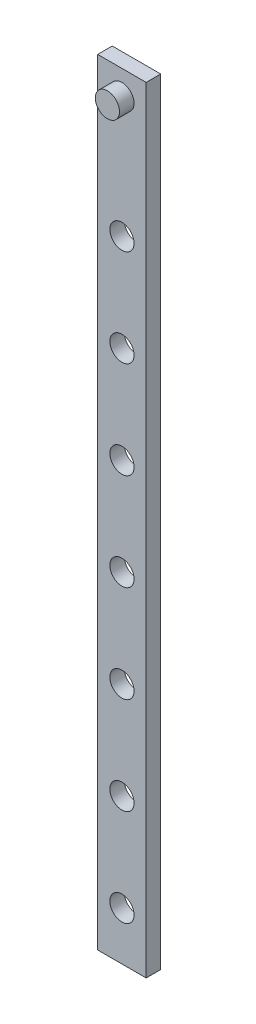
ISO-10303-21;
HEADER;
FILE_DESCRIPTION(('STEP AP214'),'2;1');
FILE_NAME('part.step','',(''),(''),'','','');
FILE_SCHEMA(('AUTOMOTIVE_DESIGN { 1 0 10303 214 1 1 1 1 }'));
ENDSEC;
DATA;
#1=APPLICATION_CONTEXT('core data for automotive mechanical design processes');
#2=APPLICATION_PROTOCOL_DEFINITION('international standard','automotive_design',2000,#1);
#3=PRODUCT_CONTEXT('',#1,'mechanical');
#4=PRODUCT('Part','Part','',(#3));
#5=PRODUCT_RELATED_PRODUCT_CATEGORY('part','',(#4));
#6=PRODUCT_DEFINITION_FORMATION('','',#4);
#7=PRODUCT_DEFINITION_CONTEXT('part definition',#1,'design');
#8=PRODUCT_DEFINITION('design','',#6,#7);
#9=PRODUCT_DEFINITION_SHAPE('','',#8);
#10=(LENGTH_UNIT() NAMED_UNIT(*) SI_UNIT(.MILLI.,.METRE.));
#11=(NAMED_UNIT(*) PLANE_ANGLE_UNIT() SI_UNIT($,.RADIAN.));
#12=(NAMED_UNIT(*) SI_UNIT($,.STERADIAN.) SOLID_ANGLE_UNIT());
#13=UNCERTAINTY_MEASURE_WITH_UNIT(LENGTH_MEASURE(1.E-05),#10,'distance_accuracy_value','');
#14=(GEOMETRIC_REPRESENTATION_CONTEXT(3) GLOBAL_UNCERTAINTY_ASSIGNED_CONTEXT((#13)) GLOBAL_UNIT_ASSIGNED_CONTEXT((#10,
#11,#12)) REPRESENTATION_CONTEXT('',''));
#15=CARTESIAN_POINT('',(0.,0.,0.));
#16=DIRECTION('',(0.,0.,1.));
#17=DIRECTION('',(1.,0.,0.));
#18=AXIS2_PLACEMENT_3D('',#15,#16,#17);
#19=CARTESIAN_POINT('',(0.,0.,3.));
#20=DIRECTION('',(0.,0.,-1.));
#21=DIRECTION('',(-1.,0.,0.));
#22=AXIS2_PLACEMENT_3D('',#19,#20,#21);
#23=PLANE('',#22);
#24=CARTESIAN_POINT('',(0.,75.,3.));
#25=DIRECTION('',(0.,0.,-1.));
#26=DIRECTION('',(-1.,0.,0.));
#27=AXIS2_PLACEMENT_3D('',#24,#25,#26);
#28=CIRCLE('',#27,2.5);
#29=CARTESIAN_POINT('',(-2.5,75.,3.));
#30=VERTEX_POINT('',#29);
#31=EDGE_CURVE('E11',#30,#30,#28,.F.);
#32=ORIENTED_EDGE('',*,*,#31,.F.);
#33=EDGE_LOOP('',(#32));
#34=FACE_BOUND('',#33,.T.);
#35=DIRECTION('',(0.,1.,0.));
#36=VECTOR('',#35,1.);
#37=CARTESIAN_POINT('',(4.99999999999997,-80.,3.));
#38=LINE('',#37,#36);
#39=CARTESIAN_POINT('',(4.99999999999997,-80.,3.));
#40=VERTEX_POINT('',#39);
#41=CARTESIAN_POINT('',(5.00000000000003,80.,3.));
#42=VERTEX_POINT('',#41);
#43=EDGE_CURVE('E86',#40,#42,#38,.T.);
#44=ORIENTED_EDGE('',*,*,#43,.T.);
#45=DIRECTION('',(-1.,0.,0.));
#46=VECTOR('',#45,1.);
#47=CARTESIAN_POINT('',(-4.99999999999997,80.,3.));
#48=LINE('',#47,#46);
#49=CARTESIAN_POINT('',(-4.99999999999997,80.,3.));
#50=VERTEX_POINT('',#49);
#51=EDGE_CURVE('E81',#42,#50,#48,.T.);
#52=ORIENTED_EDGE('',*,*,#51,.T.);
#53=DIRECTION('',(0.,-1.,0.));
#54=VECTOR('',#53,1.);
#55=CARTESIAN_POINT('',(-4.99999999999997,-80.,3.));
#56=LINE('',#55,#54);
#57=CARTESIAN_POINT('',(-4.99999999999997,-80.,3.));
#58=VERTEX_POINT('',#57);
#59=EDGE_CURVE('E84',#50,#58,#56,.T.);
#60=ORIENTED_EDGE('',*,*,#59,.T.);
#61=DIRECTION('',(1.,0.,0.));
#62=VECTOR('',#61,1.);
#63=CARTESIAN_POINT('',(-4.99999999999997,-80.,3.));
#64=LINE('',#63,#62);
#65=EDGE_CURVE('E50',#58,#40,#64,.T.);
#66=ORIENTED_EDGE('',*,*,#65,.T.);
#67=EDGE_LOOP('',(#44,#52,#60,#66));
#68=FACE_BOUND('',#67,.T.);
#69=CARTESIAN_POINT('',(0.,-70.,3.));
#70=DIRECTION('',(0.,0.,1.));
#71=DIRECTION('',(1.,0.,0.));
#72=AXIS2_PLACEMENT_3D('',#69,#70,#71);
#73=CIRCLE('',#72,2.5);
#74=CARTESIAN_POINT('',(2.5,-70.,3.));
#75=VERTEX_POINT('',#74);
#76=EDGE_CURVE('E103',#75,#75,#73,.T.);
#77=ORIENTED_EDGE('',*,*,#76,.F.);
#78=EDGE_LOOP('',(#77));
#79=FACE_BOUND('',#78,.T.);
#80=CARTESIAN_POINT('',(0.,-50.,3.));
#81=DIRECTION('',(0.,0.,1.));
#82=DIRECTION('',(1.,0.,0.));
#83=AXIS2_PLACEMENT_3D('',#80,#81,#82);
#84=CIRCLE('',#83,2.5);
#85=CARTESIAN_POINT('',(2.5,-50.,3.));
#86=VERTEX_POINT('',#85);
#87=EDGE_CURVE('E161',#86,#86,#84,.T.);
#88=ORIENTED_EDGE('',*,*,#87,.F.);
#89=EDGE_LOOP('',(#88));
#90=FACE_BOUND('',#89,.T.);
#91=CARTESIAN_POINT('',(0.,-30.,3.));
#92=DIRECTION('',(0.,0.,1.));
#93=DIRECTION('',(1.,0.,0.));
#94=AXIS2_PLACEMENT_3D('',#91,#92,#93);
#95=CIRCLE('',#94,2.5);
#96=CARTESIAN_POINT('',(2.5,-30.,3.));
#97=VERTEX_POINT('',#96);
#98=EDGE_CURVE('E156',#97,#97,#95,.T.);
#99=ORIENTED_EDGE('',*,*,#98,.F.);
#100=EDGE_LOOP('',(#99));
#101=FACE_BOUND('',#100,.T.);
#102=CARTESIAN_POINT('',(0.,-10.,3.));
#103=DIRECTION('',(0.,0.,1.));
#104=DIRECTION('',(1.,0.,0.));
#105=AXIS2_PLACEMENT_3D('',#102,#103,#104);
#106=CIRCLE('',#105,2.5);
#107=CARTESIAN_POINT('',(2.5,-10.,3.));
#108=VERTEX_POINT('',#107);
#109=EDGE_CURVE('E151',#108,#108,#106,.T.);
#110=ORIENTED_EDGE('',*,*,#109,.F.);
#111=EDGE_LOOP('',(#110));
#112=FACE_BOUND('',#111,.T.);
#113=CARTESIAN_POINT('',(0.,9.99999999999997,3.));
#114=DIRECTION('',(0.,0.,1.));
#115=DIRECTION('',(1.,0.,0.));
#116=AXIS2_PLACEMENT_3D('',#113,#114,#115);
#117=CIRCLE('',#116,2.5);
#118=CARTESIAN_POINT('',(2.5,9.99999999999997,3.));
#119=VERTEX_POINT('',#118);
#120=EDGE_CURVE('E146',#119,#119,#117,.T.);
#121=ORIENTED_EDGE('',*,*,#120,.F.);
#122=EDGE_LOOP('',(#121));
#123=FACE_BOUND('',#122,.T.);
#124=CARTESIAN_POINT('',(0.,30.,3.));
#125=DIRECTION('',(0.,0.,1.));
#126=DIRECTION('',(1.,0.,0.));
#127=AXIS2_PLACEMENT_3D('',#124,#125,#126);
#128=CIRCLE('',#127,2.5);
#129=CARTESIAN_POINT('',(2.5,30.,3.));
#130=VERTEX_POINT('',#129);
#131=EDGE_CURVE('E141',#130,#130,#128,.T.);
#132=ORIENTED_EDGE('',*,*,#131,.F.);
#133=EDGE_LOOP('',(#132));
#134=FACE_BOUND('',#133,.T.);
#135=CARTESIAN_POINT('',(0.,50.,3.));
#136=DIRECTION('',(0.,0.,1.));
#137=DIRECTION('',(1.,0.,0.));
#138=AXIS2_PLACEMENT_3D('',#135,#136,#137);
#139=CIRCLE('',#138,2.5);
#140=CARTESIAN_POINT('',(2.5,50.,3.));
#141=VERTEX_POINT('',#140);
#142=EDGE_CURVE('E132',#141,#141,#139,.T.);
#143=ORIENTED_EDGE('',*,*,#142,.F.);
#144=EDGE_LOOP('',(#143));
#145=FACE_BOUND('',#144,.T.);
#146=ADVANCED_FACE('F33',(#34,#68,#79,#90,#101,#112,#123,#134,#145),#23,.F.);
#147=CARTESIAN_POINT('',(0.,0.,0.));
#148=DIRECTION('',(0.,0.,-1.));
#149=DIRECTION('',(-1.,0.,0.));
#150=AXIS2_PLACEMENT_3D('',#147,#148,#149);
#151=PLANE('',#150);
#152=CARTESIAN_POINT('',(0.,30.,0.));
#153=DIRECTION('',(0.,0.,1.));
#154=DIRECTION('',(1.,0.,0.));
#155=AXIS2_PLACEMENT_3D('',#152,#153,#154);
#156=CIRCLE('',#155,2.5);
#157=CARTESIAN_POINT('',(2.5,30.,0.));
#158=VERTEX_POINT('',#157);
#159=EDGE_CURVE('E136',#158,#158,#156,.T.);
#160=ORIENTED_EDGE('',*,*,#159,.T.);
#161=EDGE_LOOP('',(#160));
#162=FACE_BOUND('',#161,.T.);
#163=CARTESIAN_POINT('',(0.,-10.,0.));
#164=DIRECTION('',(0.,0.,1.));
#165=DIRECTION('',(1.,0.,0.));
#166=AXIS2_PLACEMENT_3D('',#163,#164,#165);
#167=CIRCLE('',#166,2.5);
#168=CARTESIAN_POINT('',(2.5,-10.,0.));
#169=VERTEX_POINT('',#168);
#170=EDGE_CURVE('E149',#169,#169,#167,.T.);
#171=ORIENTED_EDGE('',*,*,#170,.T.);
#172=EDGE_LOOP('',(#171));
#173=FACE_BOUND('',#172,.T.);
#174=CARTESIAN_POINT('',(0.,-50.,0.));
#175=DIRECTION('',(0.,0.,1.));
#176=DIRECTION('',(1.,0.,0.));
#177=AXIS2_PLACEMENT_3D('',#174,#175,#176);
#178=CIRCLE('',#177,2.5);
#179=CARTESIAN_POINT('',(2.5,-50.,0.));
#180=VERTEX_POINT('',#179);
#181=EDGE_CURVE('E159',#180,#180,#178,.T.);
#182=ORIENTED_EDGE('',*,*,#181,.T.);
#183=EDGE_LOOP('',(#182));
#184=FACE_BOUND('',#183,.T.);
#185=DIRECTION('',(0.,1.,0.));
#186=VECTOR('',#185,1.);
#187=CARTESIAN_POINT('',(4.99999999999997,-80.,0.));
#188=LINE('',#187,#186);
#189=CARTESIAN_POINT('',(4.99999999999997,-80.,0.));
#190=VERTEX_POINT('',#189);
#191=CARTESIAN_POINT('',(5.00000000000003,80.,0.));
#192=VERTEX_POINT('',#191);
#193=EDGE_CURVE('E100',#190,#192,#188,.T.);
#194=ORIENTED_EDGE('',*,*,#193,.F.);
#195=DIRECTION('',(1.,0.,0.));
#196=VECTOR('',#195,1.);
#197=CARTESIAN_POINT('',(-4.99999999999997,-80.,0.));
#198=LINE('',#197,#196);
#199=CARTESIAN_POINT('',(-4.99999999999997,-80.,0.));
#200=VERTEX_POINT('',#199);
#201=EDGE_CURVE('E73',#200,#190,#198,.T.);
#202=ORIENTED_EDGE('',*,*,#201,.F.);
#203=DIRECTION('',(0.,-1.,0.));
#204=VECTOR('',#203,1.);
#205=CARTESIAN_POINT('',(-4.99999999999997,-80.,0.));
#206=LINE('',#205,#204);
#207=CARTESIAN_POINT('',(-4.99999999999997,80.,0.));
#208=VERTEX_POINT('',#207);
#209=EDGE_CURVE('E67',#208,#200,#206,.T.);
#210=ORIENTED_EDGE('',*,*,#209,.F.);
#211=DIRECTION('',(-1.,0.,0.));
#212=VECTOR('',#211,1.);
#213=CARTESIAN_POINT('',(-4.99999999999997,80.,0.));
#214=LINE('',#213,#212);
#215=EDGE_CURVE('E91',#192,#208,#214,.T.);
#216=ORIENTED_EDGE('',*,*,#215,.F.);
#217=EDGE_LOOP('',(#194,#202,#210,#216));
#218=FACE_BOUND('',#217,.T.);
#219=CARTESIAN_POINT('',(0.,-70.,0.));
#220=DIRECTION('',(0.,0.,1.));
#221=DIRECTION('',(1.,0.,0.));
#222=AXIS2_PLACEMENT_3D('',#219,#220,#221);
#223=CIRCLE('',#222,2.5);
#224=CARTESIAN_POINT('',(2.5,-70.,0.));
#225=VERTEX_POINT('',#224);
#226=EDGE_CURVE('E119',#225,#225,#223,.T.);
#227=ORIENTED_EDGE('',*,*,#226,.T.);
#228=EDGE_LOOP('',(#227));
#229=FACE_BOUND('',#228,.T.);
#230=CARTESIAN_POINT('',(0.,-30.,0.));
#231=DIRECTION('',(0.,0.,1.));
#232=DIRECTION('',(1.,0.,0.));
#233=AXIS2_PLACEMENT_3D('',#230,#231,#232);
#234=CIRCLE('',#233,2.5);
#235=CARTESIAN_POINT('',(2.5,-30.,0.));
#236=VERTEX_POINT('',#235);
#237=EDGE_CURVE('E123',#236,#236,#234,.T.);
#238=ORIENTED_EDGE('',*,*,#237,.T.);
#239=EDGE_LOOP('',(#238));
#240=FACE_BOUND('',#239,.T.);
#241=CARTESIAN_POINT('',(0.,9.99999999999997,0.));
#242=DIRECTION('',(0.,0.,1.));
#243=DIRECTION('',(1.,0.,0.));
#244=AXIS2_PLACEMENT_3D('',#241,#242,#243);
#245=CIRCLE('',#244,2.5);
#246=CARTESIAN_POINT('',(2.5,9.99999999999997,0.));
#247=VERTEX_POINT('',#246);
#248=EDGE_CURVE('E127',#247,#247,#245,.T.);
#249=ORIENTED_EDGE('',*,*,#248,.T.);
#250=EDGE_LOOP('',(#249));
#251=FACE_BOUND('',#250,.T.);
#252=CARTESIAN_POINT('',(0.,50.,0.));
#253=DIRECTION('',(0.,0.,1.));
#254=DIRECTION('',(1.,0.,0.));
#255=AXIS2_PLACEMENT_3D('',#252,#253,#254);
#256=CIRCLE('',#255,2.5);
#257=CARTESIAN_POINT('',(2.5,50.,0.));
#258=VERTEX_POINT('',#257);
#259=EDGE_CURVE('E130',#258,#258,#256,.T.);
#260=ORIENTED_EDGE('',*,*,#259,.T.);
#261=EDGE_LOOP('',(#260));
#262=FACE_BOUND('',#261,.T.);
#263=ADVANCED_FACE('F111',(#162,#173,#184,#218,#229,#240,#251,#262),#151,.T.);
#264=CARTESIAN_POINT('',(4.99999999999997,-80.,3.));
#265=DIRECTION('',(-1.,0.,0.));
#266=DIRECTION('',(0.,-1.,0.));
#267=AXIS2_PLACEMENT_3D('',#264,#265,#266);
#268=PLANE('',#267);
#269=ORIENTED_EDGE('',*,*,#193,.T.);
#270=DIRECTION('',(0.,0.,-1.));
#271=VECTOR('',#270,1.);
#272=CARTESIAN_POINT('',(5.00000000000003,80.,3.));
#273=LINE('',#272,#271);
#274=EDGE_CURVE('E42',#42,#192,#273,.T.);
#275=ORIENTED_EDGE('',*,*,#274,.F.);
#276=ORIENTED_EDGE('',*,*,#43,.F.);
#277=DIRECTION('',(0.,0.,-1.));
#278=VECTOR('',#277,1.);
#279=CARTESIAN_POINT('',(4.99999999999997,-80.,3.));
#280=LINE('',#279,#278);
#281=EDGE_CURVE('E96',#40,#190,#280,.T.);
#282=ORIENTED_EDGE('',*,*,#281,.T.);
#283=EDGE_LOOP('',(#269,#275,#276,#282));
#284=FACE_BOUND('',#283,.T.);
#285=ADVANCED_FACE('F35',(#284),#268,.F.);
#286=CARTESIAN_POINT('',(-4.99999999999997,80.,3.));
#287=DIRECTION('',(0.,-1.,0.));
#288=DIRECTION('',(0.,0.,-1.));
#289=AXIS2_PLACEMENT_3D('',#286,#287,#288);
#290=PLANE('',#289);
#291=ORIENTED_EDGE('',*,*,#215,.T.);
#292=DIRECTION('',(0.,0.,-1.));
#293=VECTOR('',#292,1.);
#294=CARTESIAN_POINT('',(-4.99999999999997,80.,3.));
#295=LINE('',#294,#293);
#296=EDGE_CURVE('E89',#50,#208,#295,.T.);
#297=ORIENTED_EDGE('',*,*,#296,.F.);
#298=ORIENTED_EDGE('',*,*,#51,.F.);
#299=ORIENTED_EDGE('',*,*,#274,.T.);
#300=EDGE_LOOP('',(#291,#297,#298,#299));
#301=FACE_BOUND('',#300,.T.);
#302=ADVANCED_FACE('F90',(#301),#290,.F.);
#303=CARTESIAN_POINT('',(-4.99999999999997,-80.,3.));
#304=DIRECTION('',(1.,0.,0.));
#305=DIRECTION('',(0.,0.,-1.));
#306=AXIS2_PLACEMENT_3D('',#303,#304,#305);
#307=PLANE('',#306);
#308=ORIENTED_EDGE('',*,*,#209,.T.);
#309=DIRECTION('',(0.,0.,-1.));
#310=VECTOR('',#309,1.);
#311=CARTESIAN_POINT('',(-4.99999999999997,-80.,3.));
#312=LINE('',#311,#310);
#313=EDGE_CURVE('E92',#58,#200,#312,.T.);
#314=ORIENTED_EDGE('',*,*,#313,.F.);
#315=ORIENTED_EDGE('',*,*,#59,.F.);
#316=ORIENTED_EDGE('',*,*,#296,.T.);
#317=EDGE_LOOP('',(#308,#314,#315,#316));
#318=FACE_BOUND('',#317,.T.);
#319=ADVANCED_FACE('F94',(#318),#307,.F.);
#320=CARTESIAN_POINT('',(-4.99999999999997,-80.,3.));
#321=DIRECTION('',(0.,1.,0.));
#322=DIRECTION('',(0.,0.,1.));
#323=AXIS2_PLACEMENT_3D('',#320,#321,#322);
#324=PLANE('',#323);
#325=ORIENTED_EDGE('',*,*,#201,.T.);
#326=ORIENTED_EDGE('',*,*,#281,.F.);
#327=ORIENTED_EDGE('',*,*,#65,.F.);
#328=ORIENTED_EDGE('',*,*,#313,.T.);
#329=EDGE_LOOP('',(#325,#326,#327,#328));
#330=FACE_BOUND('',#329,.T.);
#331=ADVANCED_FACE('F221',(#330),#324,.F.);
#332=CARTESIAN_POINT('',(0.,-70.,3.));
#333=DIRECTION('',(0.,0.,-1.));
#334=DIRECTION('',(-1.,0.,0.));
#335=AXIS2_PLACEMENT_3D('',#332,#333,#334);
#336=CYLINDRICAL_SURFACE('',#335,2.5);
#337=ORIENTED_EDGE('',*,*,#76,.T.);
#338=EDGE_LOOP('',(#337));
#339=FACE_BOUND('',#338,.T.);
#340=ORIENTED_EDGE('',*,*,#226,.F.);
#341=EDGE_LOOP('',(#340));
#342=FACE_BOUND('',#341,.T.);
#343=ADVANCED_FACE('F170',(#339,#342),#336,.F.);
#344=CARTESIAN_POINT('',(0.,-50.,3.));
#345=DIRECTION('',(0.,0.,-1.));
#346=DIRECTION('',(-1.,0.,0.));
#347=AXIS2_PLACEMENT_3D('',#344,#345,#346);
#348=CYLINDRICAL_SURFACE('',#347,2.5);
#349=ORIENTED_EDGE('',*,*,#87,.T.);
#350=EDGE_LOOP('',(#349));
#351=FACE_BOUND('',#350,.T.);
#352=ORIENTED_EDGE('',*,*,#181,.F.);
#353=EDGE_LOOP('',(#352));
#354=FACE_BOUND('',#353,.T.);
#355=ADVANCED_FACE('F215',(#351,#354),#348,.F.);
#356=CARTESIAN_POINT('',(0.,-30.,3.));
#357=DIRECTION('',(0.,0.,-1.));
#358=DIRECTION('',(-1.,0.,0.));
#359=AXIS2_PLACEMENT_3D('',#356,#357,#358);
#360=CYLINDRICAL_SURFACE('',#359,2.5);
#361=ORIENTED_EDGE('',*,*,#98,.T.);
#362=EDGE_LOOP('',(#361));
#363=FACE_BOUND('',#362,.T.);
#364=ORIENTED_EDGE('',*,*,#237,.F.);
#365=EDGE_LOOP('',(#364));
#366=FACE_BOUND('',#365,.T.);
#367=ADVANCED_FACE('F211',(#363,#366),#360,.F.);
#368=CARTESIAN_POINT('',(0.,-10.,3.));
#369=DIRECTION('',(0.,0.,-1.));
#370=DIRECTION('',(-1.,0.,0.));
#371=AXIS2_PLACEMENT_3D('',#368,#369,#370);
#372=CYLINDRICAL_SURFACE('',#371,2.5);
#373=ORIENTED_EDGE('',*,*,#109,.T.);
#374=EDGE_LOOP('',(#373));
#375=FACE_BOUND('',#374,.T.);
#376=ORIENTED_EDGE('',*,*,#170,.F.);
#377=EDGE_LOOP('',(#376));
#378=FACE_BOUND('',#377,.T.);
#379=ADVANCED_FACE('F207',(#375,#378),#372,.F.);
#380=CARTESIAN_POINT('',(0.,9.99999999999997,3.));
#381=DIRECTION('',(0.,0.,-1.));
#382=DIRECTION('',(-1.,0.,0.));
#383=AXIS2_PLACEMENT_3D('',#380,#381,#382);
#384=CYLINDRICAL_SURFACE('',#383,2.5);
#385=ORIENTED_EDGE('',*,*,#120,.T.);
#386=EDGE_LOOP('',(#385));
#387=FACE_BOUND('',#386,.T.);
#388=ORIENTED_EDGE('',*,*,#248,.F.);
#389=EDGE_LOOP('',(#388));
#390=FACE_BOUND('',#389,.T.);
#391=ADVANCED_FACE('F200',(#387,#390),#384,.F.);
#392=CARTESIAN_POINT('',(0.,30.,3.));
#393=DIRECTION('',(0.,0.,-1.));
#394=DIRECTION('',(-1.,0.,0.));
#395=AXIS2_PLACEMENT_3D('',#392,#393,#394);
#396=CYLINDRICAL_SURFACE('',#395,2.5);
#397=ORIENTED_EDGE('',*,*,#131,.T.);
#398=EDGE_LOOP('',(#397));
#399=FACE_BOUND('',#398,.T.);
#400=ORIENTED_EDGE('',*,*,#159,.F.);
#401=EDGE_LOOP('',(#400));
#402=FACE_BOUND('',#401,.T.);
#403=ADVANCED_FACE('F191',(#399,#402),#396,.F.);
#404=CARTESIAN_POINT('',(0.,50.,3.));
#405=DIRECTION('',(0.,0.,-1.));
#406=DIRECTION('',(-1.,0.,0.));
#407=AXIS2_PLACEMENT_3D('',#404,#405,#406);
#408=CYLINDRICAL_SURFACE('',#407,2.5);
#409=ORIENTED_EDGE('',*,*,#142,.T.);
#410=EDGE_LOOP('',(#409));
#411=FACE_BOUND('',#410,.T.);
#412=ORIENTED_EDGE('',*,*,#259,.F.);
#413=EDGE_LOOP('',(#412));
#414=FACE_BOUND('',#413,.T.);
#415=ADVANCED_FACE('F188',(#411,#414),#408,.F.);
#416=CARTESIAN_POINT('',(0.,75.,6.));
#417=DIRECTION('',(0.,0.,-1.));
#418=DIRECTION('',(-1.,0.,0.));
#419=AXIS2_PLACEMENT_3D('',#416,#417,#418);
#420=CYLINDRICAL_SURFACE('',#419,2.5);
#421=CARTESIAN_POINT('',(0.,75.,6.));
#422=DIRECTION('',(0.,0.,1.));
#423=DIRECTION('',(1.,0.,0.));
#424=AXIS2_PLACEMENT_3D('',#421,#422,#423);
#425=CIRCLE('',#424,2.5);
#426=CARTESIAN_POINT('',(2.5,75.,6.));
#427=VERTEX_POINT('',#426);
#428=EDGE_CURVE('E133',#427,#427,#425,.T.);
#429=ORIENTED_EDGE('',*,*,#428,.F.);
#430=EDGE_LOOP('',(#429));
#431=FACE_BOUND('',#430,.T.);
#432=ORIENTED_EDGE('',*,*,#31,.T.);
#433=EDGE_LOOP('',(#432));
#434=FACE_BOUND('',#433,.T.);
#435=ADVANCED_FACE('F190',(#431,#434),#420,.T.);
#436=CARTESIAN_POINT('',(0.,75.,6.));
#437=DIRECTION('',(0.,0.,1.));
#438=DIRECTION('',(1.,0.,0.));
#439=AXIS2_PLACEMENT_3D('',#436,#437,#438);
#440=PLANE('',#439);
#441=ORIENTED_EDGE('',*,*,#428,.T.);
#442=EDGE_LOOP('',(#441));
#443=FACE_BOUND('',#442,.T.);
#444=ADVANCED_FACE('F197',(#443),#440,.T.);
#445=CLOSED_SHELL('',(#146,#263,#285,#302,#319,#331,#343,#355,#367,#379,#391,#403,#415,#435,#444));
#446=MANIFOLD_SOLID_BREP('B2',#445);
#447=ADVANCED_BREP_SHAPE_REPRESENTATION('',(#18,#446),#14);
#448=SHAPE_DEFINITION_REPRESENTATION(#9,#447);
ENDSEC;
END-ISO-10303-21;
